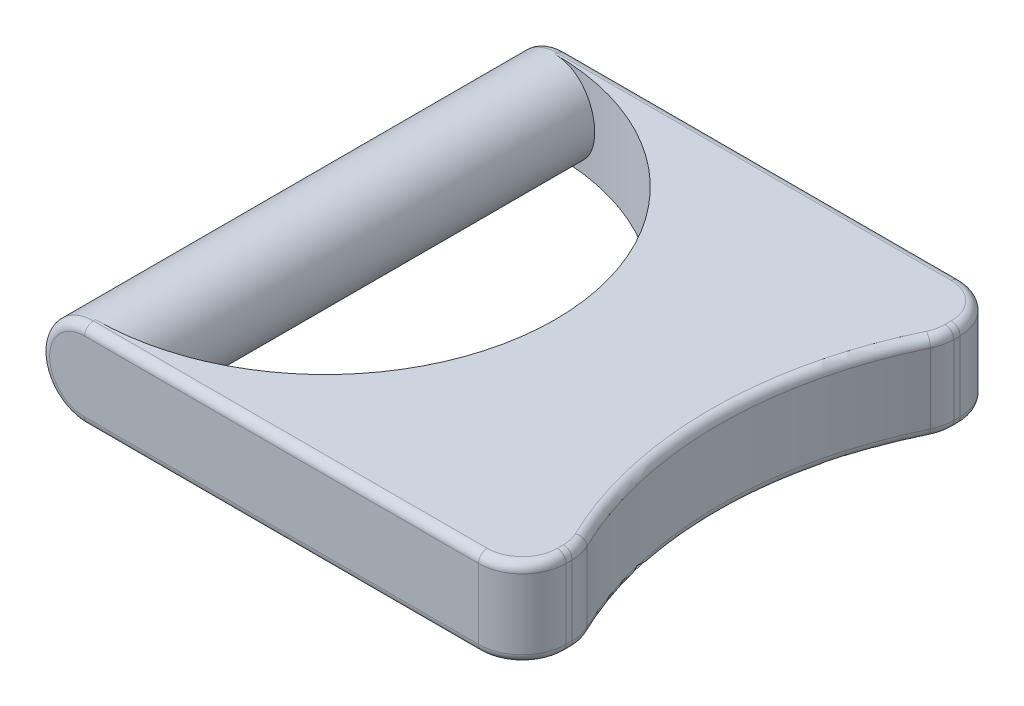
ISO-10303-21;
HEADER;
FILE_DESCRIPTION(('STEP AP214'),'2;1');
FILE_NAME('part.step','',(''),(''),'','','');
FILE_SCHEMA(('AUTOMOTIVE_DESIGN { 1 0 10303 214 1 1 1 1 }'));
ENDSEC;
DATA;
#1=APPLICATION_CONTEXT('core data for automotive mechanical design processes');
#2=APPLICATION_PROTOCOL_DEFINITION('international standard','automotive_design',2000,#1);
#3=PRODUCT_CONTEXT('',#1,'mechanical');
#4=PRODUCT('Part','Part','',(#3));
#5=PRODUCT_RELATED_PRODUCT_CATEGORY('part','',(#4));
#6=PRODUCT_DEFINITION_FORMATION('','',#4);
#7=PRODUCT_DEFINITION_CONTEXT('part definition',#1,'design');
#8=PRODUCT_DEFINITION('design','',#6,#7);
#9=PRODUCT_DEFINITION_SHAPE('','',#8);
#10=(LENGTH_UNIT() NAMED_UNIT(*) SI_UNIT(.MILLI.,.METRE.));
#11=(NAMED_UNIT(*) PLANE_ANGLE_UNIT() SI_UNIT($,.RADIAN.));
#12=(NAMED_UNIT(*) SI_UNIT($,.STERADIAN.) SOLID_ANGLE_UNIT());
#13=UNCERTAINTY_MEASURE_WITH_UNIT(LENGTH_MEASURE(1.E-05),#10,'distance_accuracy_value','');
#14=(GEOMETRIC_REPRESENTATION_CONTEXT(3) GLOBAL_UNCERTAINTY_ASSIGNED_CONTEXT((#13)) GLOBAL_UNIT_ASSIGNED_CONTEXT((#10,
#11,#12)) REPRESENTATION_CONTEXT('',''));
#15=CARTESIAN_POINT('',(0.,0.,0.));
#16=DIRECTION('',(0.,0.,1.));
#17=DIRECTION('',(1.,0.,0.));
#18=AXIS2_PLACEMENT_3D('',#15,#16,#17);
#19=CARTESIAN_POINT('',(9.,1.,-4.35889894354067));
#20=DIRECTION('',(0.,-1.,0.));
#21=DIRECTION('',(0.,0.,-1.));
#22=AXIS2_PLACEMENT_3D('',#19,#20,#21);
#23=CYLINDRICAL_SURFACE('',#22,1.);
#24=DIRECTION('',(0.,1.,0.));
#25=VECTOR('',#24,1.);
#26=CARTESIAN_POINT('',(10.,1.,-4.35889894354067));
#27=LINE('',#26,#25);
#28=CARTESIAN_POINT('',(10.,-0.8,-4.35889894354067));
#29=VERTEX_POINT('',#28);
#30=CARTESIAN_POINT('',(10.,0.8,-4.35889894354067));
#31=VERTEX_POINT('',#30);
#32=EDGE_CURVE('E489',#29,#31,#27,.T.);
#33=ORIENTED_EDGE('',*,*,#32,.T.);
#34=CARTESIAN_POINT('',(9.,0.8,-4.35889894354067));
#35=DIRECTION('',(0.,-1.,0.));
#36=DIRECTION('',(0.,0.,-1.));
#37=AXIS2_PLACEMENT_3D('',#34,#35,#36);
#38=CIRCLE('',#37,1.);
#39=CARTESIAN_POINT('',(9.9,0.8,-3.92300904918661));
#40=VERTEX_POINT('',#39);
#41=EDGE_CURVE('E686',#31,#40,#38,.T.);
#42=ORIENTED_EDGE('',*,*,#41,.T.);
#43=DIRECTION('',(0.,-1.,0.));
#44=VECTOR('',#43,1.);
#45=CARTESIAN_POINT('',(9.9,1.,-3.9230090491866));
#46=LINE('',#45,#44);
#47=CARTESIAN_POINT('',(9.9,-0.8,-3.9230090491866));
#48=VERTEX_POINT('',#47);
#49=EDGE_CURVE('E493',#40,#48,#46,.T.);
#50=ORIENTED_EDGE('',*,*,#49,.T.);
#51=CARTESIAN_POINT('',(9.,-0.8,-4.35889894354067));
#52=DIRECTION('',(0.,-1.,0.));
#53=DIRECTION('',(0.,0.,-1.));
#54=AXIS2_PLACEMENT_3D('',#51,#52,#53);
#55=CIRCLE('',#54,1.);
#56=EDGE_CURVE('E585',#29,#48,#55,.T.);
#57=ORIENTED_EDGE('',*,*,#56,.F.);
#58=EDGE_LOOP('',(#33,#42,#50,#57));
#59=FACE_BOUND('',#58,.T.);
#60=ADVANCED_FACE('F17',(#59),#23,.T.);
#61=CARTESIAN_POINT('',(9.,1.,4.35889894354067));
#62=DIRECTION('',(0.,-1.,0.));
#63=DIRECTION('',(0.,0.,-1.));
#64=AXIS2_PLACEMENT_3D('',#61,#62,#63);
#65=CYLINDRICAL_SURFACE('',#64,1.);
#66=DIRECTION('',(0.,-1.,0.));
#67=VECTOR('',#66,1.);
#68=CARTESIAN_POINT('',(9.90000000000001,1.,3.92300904918661));
#69=LINE('',#68,#67);
#70=CARTESIAN_POINT('',(9.9,-0.8,3.92300904918661));
#71=VERTEX_POINT('',#70);
#72=CARTESIAN_POINT('',(9.9,0.8,3.92300904918661));
#73=VERTEX_POINT('',#72);
#74=EDGE_CURVE('E660',#71,#73,#69,.F.);
#75=ORIENTED_EDGE('',*,*,#74,.T.);
#76=CARTESIAN_POINT('',(9.,0.8,4.35889894354067));
#77=DIRECTION('',(0.,-1.,0.));
#78=DIRECTION('',(0.,0.,-1.));
#79=AXIS2_PLACEMENT_3D('',#76,#77,#78);
#80=CIRCLE('',#79,1.);
#81=CARTESIAN_POINT('',(10.,0.8,4.35889894354067));
#82=VERTEX_POINT('',#81);
#83=EDGE_CURVE('E682',#73,#82,#80,.T.);
#84=ORIENTED_EDGE('',*,*,#83,.T.);
#85=DIRECTION('',(0.,1.,0.));
#86=VECTOR('',#85,1.);
#87=CARTESIAN_POINT('',(10.,1.,4.35889894354067));
#88=LINE('',#87,#86);
#89=CARTESIAN_POINT('',(10.,-0.8,4.35889894354067));
#90=VERTEX_POINT('',#89);
#91=EDGE_CURVE('E676',#82,#90,#88,.F.);
#92=ORIENTED_EDGE('',*,*,#91,.T.);
#93=CARTESIAN_POINT('',(9.,-0.8,4.35889894354067));
#94=DIRECTION('',(0.,-1.,0.));
#95=DIRECTION('',(0.,0.,-1.));
#96=AXIS2_PLACEMENT_3D('',#93,#94,#95);
#97=CIRCLE('',#96,1.);
#98=EDGE_CURVE('E538',#71,#90,#97,.T.);
#99=ORIENTED_EDGE('',*,*,#98,.F.);
#100=EDGE_LOOP('',(#75,#84,#92,#99));
#101=FACE_BOUND('',#100,.T.);
#102=ADVANCED_FACE('F1046',(#101),#65,.T.);
#103=CARTESIAN_POINT('',(10.,1.,4.35889894354067));
#104=DIRECTION('',(-1.,0.,0.));
#105=DIRECTION('',(0.,0.,1.));
#106=AXIS2_PLACEMENT_3D('',#103,#104,#105);
#107=PLANE('',#106);
#108=DIRECTION('',(0.,0.,1.));
#109=VECTOR('',#108,1.);
#110=CARTESIAN_POINT('',(10.,-0.8,4.35889894354067));
#111=LINE('',#110,#109);
#112=CARTESIAN_POINT('',(10.,-0.8,4.49999999999999));
#113=VERTEX_POINT('',#112);
#114=EDGE_CURVE('E537',#90,#113,#111,.T.);
#115=ORIENTED_EDGE('',*,*,#114,.F.);
#116=ORIENTED_EDGE('',*,*,#91,.F.);
#117=DIRECTION('',(0.,0.,1.));
#118=VECTOR('',#117,1.);
#119=CARTESIAN_POINT('',(10.,0.8,4.35889894354067));
#120=LINE('',#119,#118);
#121=CARTESIAN_POINT('',(10.,0.8,4.49999999999999));
#122=VERTEX_POINT('',#121);
#123=EDGE_CURVE('E679',#122,#82,#120,.F.);
#124=ORIENTED_EDGE('',*,*,#123,.F.);
#125=DIRECTION('',(0.,-1.,0.));
#126=VECTOR('',#125,1.);
#127=CARTESIAN_POINT('',(10.,1.,4.49999999999999));
#128=LINE('',#127,#126);
#129=EDGE_CURVE('E659',#113,#122,#128,.F.);
#130=ORIENTED_EDGE('',*,*,#129,.F.);
#131=EDGE_LOOP('',(#115,#116,#124,#130));
#132=FACE_BOUND('',#131,.T.);
#133=ADVANCED_FACE('F1039',(#132),#107,.F.);
#134=CARTESIAN_POINT('',(0.,0.,5.3));
#135=DIRECTION('',(0.,0.,1.));
#136=DIRECTION('',(1.,0.,0.));
#137=AXIS2_PLACEMENT_3D('',#134,#135,#136);
#138=TOROIDAL_SURFACE('',#137,0.8,0.2);
#139=CARTESIAN_POINT('',(0.,-0.8,5.3));
#140=DIRECTION('',(1.,0.,0.));
#141=DIRECTION('',(0.,0.,-1.));
#142=AXIS2_PLACEMENT_3D('',#139,#140,#141);
#143=CIRCLE('',#142,0.2);
#144=CARTESIAN_POINT('',(0.,-0.8,5.5));
#145=VERTEX_POINT('',#144);
#146=CARTESIAN_POINT('',(0.,-1.,5.3));
#147=VERTEX_POINT('',#146);
#148=EDGE_CURVE('E609',#145,#147,#143,.T.);
#149=ORIENTED_EDGE('',*,*,#148,.F.);
#150=CARTESIAN_POINT('',(0.,0.,5.5));
#151=DIRECTION('',(0.,0.,-1.));
#152=DIRECTION('',(0.,-1.,0.));
#153=AXIS2_PLACEMENT_3D('',#150,#151,#152);
#154=CIRCLE('',#153,0.8);
#155=CARTESIAN_POINT('',(0.,0.8,5.5));
#156=VERTEX_POINT('',#155);
#157=EDGE_CURVE('E448',#156,#145,#154,.F.);
#158=ORIENTED_EDGE('',*,*,#157,.F.);
#159=CARTESIAN_POINT('',(0.,0.8,5.3));
#160=DIRECTION('',(-1.,0.,0.));
#161=DIRECTION('',(0.,1.,0.));
#162=AXIS2_PLACEMENT_3D('',#159,#160,#161);
#163=CIRCLE('',#162,0.2);
#164=CARTESIAN_POINT('',(0.,1.,5.3));
#165=VERTEX_POINT('',#164);
#166=EDGE_CURVE('E669',#156,#165,#163,.T.);
#167=ORIENTED_EDGE('',*,*,#166,.T.);
#168=CARTESIAN_POINT('',(0.,0.,5.3));
#169=DIRECTION('',(0.,0.,1.));
#170=DIRECTION('',(1.,0.,0.));
#171=AXIS2_PLACEMENT_3D('',#168,#169,#170);
#172=CIRCLE('',#171,1.);
#173=EDGE_CURVE('E181',#165,#147,#172,.T.);
#174=ORIENTED_EDGE('',*,*,#173,.T.);
#175=EDGE_LOOP('',(#149,#158,#167,#174));
#176=FACE_BOUND('',#175,.T.);
#177=ADVANCED_FACE('F643',(#176),#138,.T.);
#178=CARTESIAN_POINT('',(9.,-0.8,4.5));
#179=DIRECTION('',(0.,-1.,0.));
#180=DIRECTION('',(0.,0.,-1.));
#181=AXIS2_PLACEMENT_3D('',#178,#179,#180);
#182=TOROIDAL_SURFACE('',#181,0.8,0.2);
#183=CARTESIAN_POINT('',(8.99999999999999,-0.8,5.3));
#184=DIRECTION('',(1.,0.,0.));
#185=DIRECTION('',(0.,0.,-1.));
#186=AXIS2_PLACEMENT_3D('',#183,#184,#185);
#187=CIRCLE('',#186,0.2);
#188=CARTESIAN_POINT('',(8.99999999999999,-1.,5.3));
#189=VERTEX_POINT('',#188);
#190=CARTESIAN_POINT('',(8.99999999999999,-0.8,5.5));
#191=VERTEX_POINT('',#190);
#192=EDGE_CURVE('E625',#189,#191,#187,.F.);
#193=ORIENTED_EDGE('',*,*,#192,.F.);
#194=CARTESIAN_POINT('',(9.,-1.,4.5));
#195=DIRECTION('',(0.,1.,0.));
#196=DIRECTION('',(0.,0.,1.));
#197=AXIS2_PLACEMENT_3D('',#194,#195,#196);
#198=CIRCLE('',#197,0.8);
#199=CARTESIAN_POINT('',(9.8,-1.,4.49999999999999));
#200=VERTEX_POINT('',#199);
#201=EDGE_CURVE('E434',#200,#189,#198,.F.);
#202=ORIENTED_EDGE('',*,*,#201,.F.);
#203=CARTESIAN_POINT('',(9.8,-0.8,4.49999999999999));
#204=DIRECTION('',(0.,0.,1.));
#205=DIRECTION('',(1.,0.,0.));
#206=AXIS2_PLACEMENT_3D('',#203,#204,#205);
#207=CIRCLE('',#206,0.200000000000001);
#208=EDGE_CURVE('E531',#113,#200,#207,.F.);
#209=ORIENTED_EDGE('',*,*,#208,.F.);
#210=CARTESIAN_POINT('',(9.,-0.8,4.5));
#211=DIRECTION('',(0.,-1.,0.));
#212=DIRECTION('',(0.,0.,-1.));
#213=AXIS2_PLACEMENT_3D('',#210,#211,#212);
#214=CIRCLE('',#213,1.);
#215=EDGE_CURVE('E651',#191,#113,#214,.F.);
#216=ORIENTED_EDGE('',*,*,#215,.F.);
#217=EDGE_LOOP('',(#193,#202,#209,#216));
#218=FACE_BOUND('',#217,.T.);
#219=ADVANCED_FACE('F638',(#218),#182,.T.);
#220=CARTESIAN_POINT('',(0.,-0.8,5.3));
#221=DIRECTION('',(1.,0.,0.));
#222=DIRECTION('',(0.,0.,-1.));
#223=AXIS2_PLACEMENT_3D('',#220,#221,#222);
#224=CYLINDRICAL_SURFACE('',#223,0.2);
#225=ORIENTED_EDGE('',*,*,#148,.T.);
#226=DIRECTION('',(1.,0.,0.));
#227=VECTOR('',#226,1.);
#228=CARTESIAN_POINT('',(9.,-1.,5.3));
#229=LINE('',#228,#227);
#230=EDGE_CURVE('E429',#189,#147,#229,.F.);
#231=ORIENTED_EDGE('',*,*,#230,.F.);
#232=ORIENTED_EDGE('',*,*,#192,.T.);
#233=DIRECTION('',(1.,0.,0.));
#234=VECTOR('',#233,1.);
#235=CARTESIAN_POINT('',(0.,-0.8,5.5));
#236=LINE('',#235,#234);
#237=EDGE_CURVE('E453',#145,#191,#236,.T.);
#238=ORIENTED_EDGE('',*,*,#237,.F.);
#239=EDGE_LOOP('',(#225,#231,#232,#238));
#240=FACE_BOUND('',#239,.T.);
#241=ADVANCED_FACE('F642',(#240),#224,.T.);
#242=CARTESIAN_POINT('',(9.8,-0.8,-4.49999999999999));
#243=DIRECTION('',(0.,0.,1.));
#244=DIRECTION('',(1.,0.,0.));
#245=AXIS2_PLACEMENT_3D('',#242,#243,#244);
#246=CYLINDRICAL_SURFACE('',#245,0.200000000000001);
#247=CARTESIAN_POINT('',(9.8,-0.8,-4.35889894354067));
#248=DIRECTION('',(0.,0.,1.));
#249=DIRECTION('',(1.,0.,0.));
#250=AXIS2_PLACEMENT_3D('',#247,#248,#249);
#251=CIRCLE('',#250,0.2);
#252=CARTESIAN_POINT('',(9.8,-1.,-4.35889894354067));
#253=VERTEX_POINT('',#252);
#254=EDGE_CURVE('E602',#253,#29,#251,.T.);
#255=ORIENTED_EDGE('',*,*,#254,.F.);
#256=DIRECTION('',(0.,0.,-1.));
#257=VECTOR('',#256,1.);
#258=CARTESIAN_POINT('',(9.8,-1.,-4.5));
#259=LINE('',#258,#257);
#260=CARTESIAN_POINT('',(9.8,-1.,-4.49999999999999));
#261=VERTEX_POINT('',#260);
#262=EDGE_CURVE('E412',#261,#253,#259,.F.);
#263=ORIENTED_EDGE('',*,*,#262,.F.);
#264=CARTESIAN_POINT('',(9.8,-0.8,-4.5));
#265=DIRECTION('',(0.,0.,1.));
#266=DIRECTION('',(1.,0.,0.));
#267=AXIS2_PLACEMENT_3D('',#264,#265,#266);
#268=CIRCLE('',#267,0.2);
#269=CARTESIAN_POINT('',(10.,-0.8,-4.49999999999999));
#270=VERTEX_POINT('',#269);
#271=EDGE_CURVE('E488',#270,#261,#268,.F.);
#272=ORIENTED_EDGE('',*,*,#271,.F.);
#273=DIRECTION('',(0.,0.,1.));
#274=VECTOR('',#273,1.);
#275=CARTESIAN_POINT('',(10.,-0.8,-4.49999999999999));
#276=LINE('',#275,#274);
#277=EDGE_CURVE('E498',#270,#29,#276,.T.);
#278=ORIENTED_EDGE('',*,*,#277,.T.);
#279=EDGE_LOOP('',(#255,#263,#272,#278));
#280=FACE_BOUND('',#279,.T.);
#281=ADVANCED_FACE('F596',(#280),#246,.T.);
#282=CARTESIAN_POINT('',(9.,-0.8,-4.35889894354067));
#283=DIRECTION('',(0.,-1.,0.));
#284=DIRECTION('',(0.,0.,-1.));
#285=AXIS2_PLACEMENT_3D('',#282,#283,#284);
#286=TOROIDAL_SURFACE('',#285,0.8,0.2);
#287=CARTESIAN_POINT('',(9.72,-0.8,-4.01018702805741));
#288=DIRECTION('',(0.435889894354067,0.,-0.9));
#289=DIRECTION('',(-0.9,0.,-0.435889894354067));
#290=AXIS2_PLACEMENT_3D('',#287,#288,#289);
#291=CIRCLE('',#290,0.2);
#292=CARTESIAN_POINT('',(9.72,-1.,-4.01018702805742));
#293=VERTEX_POINT('',#292);
#294=EDGE_CURVE('E566',#293,#48,#291,.F.);
#295=ORIENTED_EDGE('',*,*,#294,.F.);
#296=CARTESIAN_POINT('',(9.,-1.,-4.35889894354067));
#297=DIRECTION('',(0.,1.,0.));
#298=DIRECTION('',(0.899999999999999,0.,0.435889894354069));
#299=AXIS2_PLACEMENT_3D('',#296,#297,#298);
#300=CIRCLE('',#299,0.800000000000001);
#301=EDGE_CURVE('E414',#253,#293,#300,.F.);
#302=ORIENTED_EDGE('',*,*,#301,.F.);
#303=ORIENTED_EDGE('',*,*,#254,.T.);
#304=ORIENTED_EDGE('',*,*,#56,.T.);
#305=EDGE_LOOP('',(#295,#302,#303,#304));
#306=FACE_BOUND('',#305,.T.);
#307=ADVANCED_FACE('F592',(#306),#286,.T.);
#308=CARTESIAN_POINT('',(18.,-0.8,0.));
#309=DIRECTION('',(0.,-1.,0.));
#310=DIRECTION('',(0.,0.,-1.));
#311=AXIS2_PLACEMENT_3D('',#308,#309,#310);
#312=TOROIDAL_SURFACE('',#311,9.2,0.2);
#313=CARTESIAN_POINT('',(9.72,-0.8,4.01018702805742));
#314=DIRECTION('',(0.435889894354067,0.,0.9));
#315=DIRECTION('',(0.9,0.,-0.435889894354067));
#316=AXIS2_PLACEMENT_3D('',#313,#314,#315);
#317=CIRCLE('',#316,0.2);
#318=CARTESIAN_POINT('',(9.72,-1.,4.01018702805742));
#319=VERTEX_POINT('',#318);
#320=EDGE_CURVE('E559',#319,#71,#317,.T.);
#321=ORIENTED_EDGE('',*,*,#320,.F.);
#322=CARTESIAN_POINT('',(18.,-1.,0.));
#323=DIRECTION('',(0.,-1.,0.));
#324=DIRECTION('',(-0.9,0.,0.435889894354068));
#325=AXIS2_PLACEMENT_3D('',#322,#323,#324);
#326=CIRCLE('',#325,9.2);
#327=EDGE_CURVE('E575',#293,#319,#326,.F.);
#328=ORIENTED_EDGE('',*,*,#327,.F.);
#329=ORIENTED_EDGE('',*,*,#294,.T.);
#330=CARTESIAN_POINT('',(18.,-0.8,0.));
#331=DIRECTION('',(0.,-1.,0.));
#332=DIRECTION('',(0.,0.,-1.));
#333=AXIS2_PLACEMENT_3D('',#330,#331,#332);
#334=CIRCLE('',#333,9.);
#335=EDGE_CURVE('E689',#48,#71,#334,.F.);
#336=ORIENTED_EDGE('',*,*,#335,.T.);
#337=EDGE_LOOP('',(#321,#328,#329,#336));
#338=FACE_BOUND('',#337,.T.);
#339=ADVANCED_FACE('F551',(#338),#312,.T.);
#340=CARTESIAN_POINT('',(9.,-0.8,4.35889894354067));
#341=DIRECTION('',(0.,-1.,0.));
#342=DIRECTION('',(0.,0.,-1.));
#343=AXIS2_PLACEMENT_3D('',#340,#341,#342);
#344=TOROIDAL_SURFACE('',#343,0.8,0.2);
#345=CARTESIAN_POINT('',(9.8,-0.8,4.35889894354067));
#346=DIRECTION('',(0.,0.,1.));
#347=DIRECTION('',(1.,0.,0.));
#348=AXIS2_PLACEMENT_3D('',#345,#346,#347);
#349=CIRCLE('',#348,0.200000000000001);
#350=CARTESIAN_POINT('',(9.8,-1.,4.35889894354067));
#351=VERTEX_POINT('',#350);
#352=EDGE_CURVE('E534',#351,#90,#349,.T.);
#353=ORIENTED_EDGE('',*,*,#352,.F.);
#354=CARTESIAN_POINT('',(9.,-1.,4.35889894354067));
#355=DIRECTION('',(0.,1.,0.));
#356=DIRECTION('',(1.,0.,0.));
#357=AXIS2_PLACEMENT_3D('',#354,#355,#356);
#358=CIRCLE('',#357,0.799999999999999);
#359=EDGE_CURVE('E398',#319,#351,#358,.F.);
#360=ORIENTED_EDGE('',*,*,#359,.F.);
#361=ORIENTED_EDGE('',*,*,#320,.T.);
#362=ORIENTED_EDGE('',*,*,#98,.T.);
#363=EDGE_LOOP('',(#353,#360,#361,#362));
#364=FACE_BOUND('',#363,.T.);
#365=ADVANCED_FACE('F547',(#364),#344,.T.);
#366=CARTESIAN_POINT('',(9.8,-0.8,4.35889894354067));
#367=DIRECTION('',(0.,0.,1.));
#368=DIRECTION('',(1.,0.,0.));
#369=AXIS2_PLACEMENT_3D('',#366,#367,#368);
#370=CYLINDRICAL_SURFACE('',#369,0.200000000000001);
#371=ORIENTED_EDGE('',*,*,#208,.T.);
#372=DIRECTION('',(0.,0.,-1.));
#373=VECTOR('',#372,1.);
#374=CARTESIAN_POINT('',(9.8,-1.,-4.5));
#375=LINE('',#374,#373);
#376=EDGE_CURVE('E403',#351,#200,#375,.F.);
#377=ORIENTED_EDGE('',*,*,#376,.F.);
#378=ORIENTED_EDGE('',*,*,#352,.T.);
#379=ORIENTED_EDGE('',*,*,#114,.T.);
#380=EDGE_LOOP('',(#371,#377,#378,#379));
#381=FACE_BOUND('',#380,.T.);
#382=ADVANCED_FACE('F519',(#381),#370,.T.);
#383=CARTESIAN_POINT('',(0.,0.,-5.3));
#384=DIRECTION('',(0.,0.,1.));
#385=DIRECTION('',(1.,0.,0.));
#386=AXIS2_PLACEMENT_3D('',#383,#384,#385);
#387=TOROIDAL_SURFACE('',#386,0.8,0.2);
#388=CARTESIAN_POINT('',(0.,0.8,-5.3));
#389=DIRECTION('',(-1.,0.,0.));
#390=DIRECTION('',(0.,1.,0.));
#391=AXIS2_PLACEMENT_3D('',#388,#389,#390);
#392=CIRCLE('',#391,0.2);
#393=CARTESIAN_POINT('',(0.,1.,-5.3));
#394=VERTEX_POINT('',#393);
#395=CARTESIAN_POINT('',(0.,0.8,-5.5));
#396=VERTEX_POINT('',#395);
#397=EDGE_CURVE('E507',#394,#396,#392,.T.);
#398=ORIENTED_EDGE('',*,*,#397,.T.);
#399=CARTESIAN_POINT('',(0.,0.,-5.5));
#400=DIRECTION('',(0.,0.,1.));
#401=DIRECTION('',(0.,1.,0.));
#402=AXIS2_PLACEMENT_3D('',#399,#400,#401);
#403=CIRCLE('',#402,0.8);
#404=CARTESIAN_POINT('',(0.,-0.8,-5.5));
#405=VERTEX_POINT('',#404);
#406=EDGE_CURVE('E350',#396,#405,#403,.T.);
#407=ORIENTED_EDGE('',*,*,#406,.T.);
#408=CARTESIAN_POINT('',(0.,-0.8,-5.3));
#409=DIRECTION('',(1.,0.,0.));
#410=DIRECTION('',(0.,0.,-1.));
#411=AXIS2_PLACEMENT_3D('',#408,#409,#410);
#412=CIRCLE('',#411,0.2);
#413=CARTESIAN_POINT('',(0.,-1.,-5.3));
#414=VERTEX_POINT('',#413);
#415=EDGE_CURVE('E499',#414,#405,#412,.T.);
#416=ORIENTED_EDGE('',*,*,#415,.F.);
#417=CARTESIAN_POINT('',(0.,0.,-5.3));
#418=DIRECTION('',(0.,0.,-1.));
#419=DIRECTION('',(-1.,0.,0.));
#420=AXIS2_PLACEMENT_3D('',#417,#418,#419);
#421=CIRCLE('',#420,1.);
#422=EDGE_CURVE('E186',#394,#414,#421,.F.);
#423=ORIENTED_EDGE('',*,*,#422,.F.);
#424=EDGE_LOOP('',(#398,#407,#416,#423));
#425=FACE_BOUND('',#424,.T.);
#426=ADVANCED_FACE('F514',(#425),#387,.T.);
#427=CARTESIAN_POINT('',(0.,-0.8,-5.3));
#428=DIRECTION('',(1.,0.,0.));
#429=DIRECTION('',(0.,0.,-1.));
#430=AXIS2_PLACEMENT_3D('',#427,#428,#429);
#431=CYLINDRICAL_SURFACE('',#430,0.2);
#432=CARTESIAN_POINT('',(9.,-0.8,-5.3));
#433=DIRECTION('',(1.,0.,0.));
#434=DIRECTION('',(0.,0.,-1.));
#435=AXIS2_PLACEMENT_3D('',#432,#433,#434);
#436=CIRCLE('',#435,0.2);
#437=CARTESIAN_POINT('',(9.,-1.,-5.3));
#438=VERTEX_POINT('',#437);
#439=CARTESIAN_POINT('',(9.,-0.8,-5.5));
#440=VERTEX_POINT('',#439);
#441=EDGE_CURVE('E486',#438,#440,#436,.T.);
#442=ORIENTED_EDGE('',*,*,#441,.F.);
#443=DIRECTION('',(1.,0.,0.));
#444=VECTOR('',#443,1.);
#445=CARTESIAN_POINT('',(9.,-1.,-5.3));
#446=LINE('',#445,#444);
#447=EDGE_CURVE('E418',#414,#438,#446,.T.);
#448=ORIENTED_EDGE('',*,*,#447,.F.);
#449=ORIENTED_EDGE('',*,*,#415,.T.);
#450=DIRECTION('',(1.,0.,0.));
#451=VECTOR('',#450,1.);
#452=CARTESIAN_POINT('',(0.,-0.8,-5.5));
#453=LINE('',#452,#451);
#454=EDGE_CURVE('E328',#405,#440,#453,.T.);
#455=ORIENTED_EDGE('',*,*,#454,.T.);
#456=EDGE_LOOP('',(#442,#448,#449,#455));
#457=FACE_BOUND('',#456,.T.);
#458=ADVANCED_FACE('F518',(#457),#431,.T.);
#459=CARTESIAN_POINT('',(10.,1.,-4.49999999999999));
#460=DIRECTION('',(-1.,0.,0.));
#461=DIRECTION('',(0.,0.,1.));
#462=AXIS2_PLACEMENT_3D('',#459,#460,#461);
#463=PLANE('',#462);
#464=ORIENTED_EDGE('',*,*,#277,.F.);
#465=DIRECTION('',(0.,-1.,0.));
#466=VECTOR('',#465,1.);
#467=CARTESIAN_POINT('',(10.,1.,-4.49999999999999));
#468=LINE('',#467,#466);
#469=CARTESIAN_POINT('',(10.,0.8,-4.49999999999999));
#470=VERTEX_POINT('',#469);
#471=EDGE_CURVE('E324',#470,#270,#468,.T.);
#472=ORIENTED_EDGE('',*,*,#471,.F.);
#473=DIRECTION('',(0.,0.,1.));
#474=VECTOR('',#473,1.);
#475=CARTESIAN_POINT('',(10.,0.8,-4.49999999999999));
#476=LINE('',#475,#474);
#477=EDGE_CURVE('E496',#31,#470,#476,.F.);
#478=ORIENTED_EDGE('',*,*,#477,.F.);
#479=ORIENTED_EDGE('',*,*,#32,.F.);
#480=EDGE_LOOP('',(#464,#472,#478,#479));
#481=FACE_BOUND('',#480,.T.);
#482=ADVANCED_FACE('F477',(#481),#463,.F.);
#483=CARTESIAN_POINT('',(9.,-0.8,-4.5));
#484=DIRECTION('',(0.,-1.,0.));
#485=DIRECTION('',(0.,0.,-1.));
#486=AXIS2_PLACEMENT_3D('',#483,#484,#485);
#487=TOROIDAL_SURFACE('',#486,0.8,0.2);
#488=ORIENTED_EDGE('',*,*,#271,.T.);
#489=CARTESIAN_POINT('',(9.,-1.,-4.5));
#490=DIRECTION('',(0.,1.,0.));
#491=DIRECTION('',(1.,0.,0.));
#492=AXIS2_PLACEMENT_3D('',#489,#490,#491);
#493=CIRCLE('',#492,0.8);
#494=EDGE_CURVE('E415',#438,#261,#493,.F.);
#495=ORIENTED_EDGE('',*,*,#494,.F.);
#496=ORIENTED_EDGE('',*,*,#441,.T.);
#497=CARTESIAN_POINT('',(9.,-0.8,-4.5));
#498=DIRECTION('',(0.,-1.,0.));
#499=DIRECTION('',(0.,0.,-1.));
#500=AXIS2_PLACEMENT_3D('',#497,#498,#499);
#501=CIRCLE('',#500,1.);
#502=EDGE_CURVE('E327',#270,#440,#501,.F.);
#503=ORIENTED_EDGE('',*,*,#502,.F.);
#504=EDGE_LOOP('',(#488,#495,#496,#503));
#505=FACE_BOUND('',#504,.T.);
#506=ADVANCED_FACE('F471',(#505),#487,.T.);
#507=CARTESIAN_POINT('',(18.,1.,0.));
#508=DIRECTION('',(0.,-1.,0.));
#509=DIRECTION('',(0.,0.,-1.));
#510=AXIS2_PLACEMENT_3D('',#507,#508,#509);
#511=CYLINDRICAL_SURFACE('',#510,9.);
#512=ORIENTED_EDGE('',*,*,#335,.F.);
#513=ORIENTED_EDGE('',*,*,#49,.F.);
#514=CARTESIAN_POINT('',(18.,0.8,0.));
#515=DIRECTION('',(0.,-1.,0.));
#516=DIRECTION('',(0.,0.,-1.));
#517=AXIS2_PLACEMENT_3D('',#514,#515,#516);
#518=CIRCLE('',#517,9.);
#519=EDGE_CURVE('E278',#73,#40,#518,.T.);
#520=ORIENTED_EDGE('',*,*,#519,.F.);
#521=ORIENTED_EDGE('',*,*,#74,.F.);
#522=EDGE_LOOP('',(#512,#513,#520,#521));
#523=FACE_BOUND('',#522,.T.);
#524=ADVANCED_FACE('F467',(#523),#511,.F.);
#525=CARTESIAN_POINT('',(9.,1.,4.5));
#526=DIRECTION('',(0.,-1.,0.));
#527=DIRECTION('',(0.,0.,-1.));
#528=AXIS2_PLACEMENT_3D('',#525,#526,#527);
#529=CYLINDRICAL_SURFACE('',#528,1.);
#530=ORIENTED_EDGE('',*,*,#129,.T.);
#531=CARTESIAN_POINT('',(9.,0.8,4.5));
#532=DIRECTION('',(0.,-1.,0.));
#533=DIRECTION('',(0.,0.,-1.));
#534=AXIS2_PLACEMENT_3D('',#531,#532,#533);
#535=CIRCLE('',#534,1.);
#536=CARTESIAN_POINT('',(8.99999999999999,0.8,5.5));
#537=VERTEX_POINT('',#536);
#538=EDGE_CURVE('E248',#537,#122,#535,.F.);
#539=ORIENTED_EDGE('',*,*,#538,.F.);
#540=DIRECTION('',(0.,1.,0.));
#541=VECTOR('',#540,1.);
#542=CARTESIAN_POINT('',(8.99999999999999,0.,5.5));
#543=LINE('',#542,#541);
#544=EDGE_CURVE('E440',#191,#537,#543,.T.);
#545=ORIENTED_EDGE('',*,*,#544,.F.);
#546=ORIENTED_EDGE('',*,*,#215,.T.);
#547=EDGE_LOOP('',(#530,#539,#545,#546));
#548=FACE_BOUND('',#547,.T.);
#549=ADVANCED_FACE('F464',(#548),#529,.T.);
#550=CARTESIAN_POINT('',(0.,0.,5.5));
#551=DIRECTION('',(0.,0.,1.));
#552=DIRECTION('',(1.,0.,0.));
#553=AXIS2_PLACEMENT_3D('',#550,#551,#552);
#554=PLANE('',#553);
#555=ORIENTED_EDGE('',*,*,#544,.T.);
#556=DIRECTION('',(-1.,0.,0.));
#557=VECTOR('',#556,1.);
#558=CARTESIAN_POINT('',(9.,0.8,5.5));
#559=LINE('',#558,#557);
#560=EDGE_CURVE('E772',#156,#537,#559,.F.);
#561=ORIENTED_EDGE('',*,*,#560,.F.);
#562=ORIENTED_EDGE('',*,*,#157,.T.);
#563=ORIENTED_EDGE('',*,*,#237,.T.);
#564=EDGE_LOOP('',(#555,#561,#562,#563));
#565=FACE_BOUND('',#564,.T.);
#566=ADVANCED_FACE('F455',(#565),#554,.T.);
#567=CARTESIAN_POINT('',(0.,0.,5.5));
#568=DIRECTION('',(0.,0.,-1.));
#569=DIRECTION('',(-1.,0.,0.));
#570=AXIS2_PLACEMENT_3D('',#567,#568,#569);
#571=CYLINDRICAL_SURFACE('',#570,1.);
#572=DIRECTION('',(0.,0.,-1.));
#573=VECTOR('',#572,1.);
#574=CARTESIAN_POINT('',(0.,1.,5.5));
#575=LINE('',#574,#573);
#576=CARTESIAN_POINT('',(0.,1.,5.25));
#577=VERTEX_POINT('',#576);
#578=EDGE_CURVE('E178',#165,#577,#575,.T.);
#579=ORIENTED_EDGE('',*,*,#578,.T.);
#580=CARTESIAN_POINT('',(0.,1.,5.25));
#581=CARTESIAN_POINT('',(0.0278662519595787,1.00000010409348,5.25000122886892));
#582=CARTESIAN_POINT('',(0.0557189152045278,0.998834469092113,5.24977785869847));
#583=CARTESIAN_POINT('',(0.111220137908951,0.994186191212378,5.24889497899721));
#584=CARTESIAN_POINT('',(0.13886871991216,0.9907038082458,5.24823551839065));
#585=CARTESIAN_POINT('',(0.221125882949768,0.976824193721324,5.24562652054502));
#586=CARTESIAN_POINT('',(0.275175861957072,0.962994340469435,5.24304624837473));
#587=CARTESIAN_POINT('',(0.380134963801984,0.92660025189307,5.23648464402961));
#588=CARTESIAN_POINT('',(0.431043517745252,0.90403443988637,5.23250305895499));
#589=CARTESIAN_POINT('',(0.528361467966492,0.850827968804526,5.22357374305839));
#590=CARTESIAN_POINT('',(0.574770751322416,0.820187107134674,5.21862598799701));
#591=CARTESIAN_POINT('',(0.662323814246634,0.751308172441524,5.20824302166558));
#592=CARTESIAN_POINT('',(0.7034049972274,0.71299127408116,5.20280310380903));
#593=CARTESIAN_POINT('',(0.77861027149677,0.630001928915434,5.19208173187501));
#594=CARTESIAN_POINT('',(0.812731748389963,0.585327104431204,5.18680033797968));
#595=CARTESIAN_POINT('',(0.873310452922385,0.490433994523111,5.1769471414069));
#596=CARTESIAN_POINT('',(0.899699307920095,0.440171376252712,5.17238182566331));
#597=CARTESIAN_POINT('',(0.943605694926473,0.335861277739533,5.16455324658576));
#598=CARTESIAN_POINT('',(0.961133774071194,0.281818384907774,5.16128843622412));
#599=CARTESIAN_POINT('',(0.98260675260274,0.189575473724406,5.15723349418876));
#600=CARTESIAN_POINT('',(0.989119053688043,0.151973237406372,5.15598325159438));
#601=CARTESIAN_POINT('',(0.997816510241658,0.0762526699560065,5.15430709685811));
#602=CARTESIAN_POINT('',(1.00000166027621,0.0381343381756564,5.15388118575136));
#603=CARTESIAN_POINT('',(0.999997578780897,-0.0556121850763087,5.15388326615818));
#604=CARTESIAN_POINT('',(0.995344454574492,-0.111258411052324,5.15479208784336));
#605=CARTESIAN_POINT('',(0.976865721192977,-0.220987029078527,5.15832514463965));
#606=CARTESIAN_POINT('',(0.963030817984844,-0.27506777856693,5.1609511178561));
#607=CARTESIAN_POINT('',(0.926630107455632,-0.380051746230091,5.1676103304548));
#608=CARTESIAN_POINT('',(0.904073246277761,-0.430958158404688,5.17164212746371));
#609=CARTESIAN_POINT('',(0.850891239604926,-0.528260092645953,5.18065711737193));
#610=CARTESIAN_POINT('',(0.820266838711723,-0.574656030470676,5.1856402224576));
#611=CARTESIAN_POINT('',(0.751400572019868,-0.662219853756542,5.19606780825002));
#612=CARTESIAN_POINT('',(0.71307517082432,-0.703321494750749,5.20151693498964));
#613=CARTESIAN_POINT('',(0.630071900726923,-0.778554324663137,5.21222187215429));
#614=CARTESIAN_POINT('',(0.585393352830044,-0.812684767580648,5.21747766184067));
#615=CARTESIAN_POINT('',(0.490511216224404,-0.873265877240596,5.22725447781173));
#616=CARTESIAN_POINT('',(0.440265674308183,-0.899651872526125,5.23176918517423));
#617=CARTESIAN_POINT('',(0.335962774964295,-0.943570685960797,5.23949957335586));
#618=CARTESIAN_POINT('',(0.28190783666713,-0.96110906600477,5.24271607001696));
#619=CARTESIAN_POINT('',(0.189619169440596,-0.982599197677946,5.24670646335199));
#620=CARTESIAN_POINT('',(0.151982678586761,-0.989117405825371,5.24793499165801));
#621=CARTESIAN_POINT('',(0.0762367543709793,-0.997818900601878,5.24958451809861));
#622=CARTESIAN_POINT('',(0.0381278854992261,-1.00000693775249,5.25000640116613));
#623=CARTESIAN_POINT('',(0.,-1.,5.25));
#624=B_SPLINE_CURVE_WITH_KNOTS('',3,(#580,#581,#582,#583,#584,#585,#586,#587,#588,#589,#590,
#591,#592,#593,#594,#595,#596,#597,#598,#599,#600,#601,#602,#603,#604,#605,#606,#607,#608,#609,
#610,#611,#612,#613,#614,#615,#616,#617,#618,#619,#620,#621,#622,#623),.UNSPECIFIED.,.F.,.F.,(4,
2,2,2,2,2,2,2,2,2,2,2,2,2,2,2,2,2,2,2,2,4),(0.,0.0835466383524701,0.167083905338021,
0.333773528231167,0.500493249616149,0.6672171542261,0.835750078442883,1.0043461954876,
1.17439094105603,1.34423279996821,1.45853942377388,1.57284619111835,1.73954238686072,
1.90640757466192,2.07310206033479,2.23978116615806,2.40837671106174,2.57699028824183,
2.7469742629898,2.91685124678277,3.03125916642855,3.14554150229467),.UNSPECIFIED.);
#625=CARTESIAN_POINT('',(0.,-1.,5.25));
#626=VERTEX_POINT('',#625);
#627=EDGE_CURVE('E167',#577,#626,#624,.T.);
#628=ORIENTED_EDGE('',*,*,#627,.T.);
#629=DIRECTION('',(0.,0.,-1.));
#630=VECTOR('',#629,1.);
#631=CARTESIAN_POINT('',(0.,-1.,-4.5));
#632=LINE('',#631,#630);
#633=EDGE_CURVE('E425',#147,#626,#632,.T.);
#634=ORIENTED_EDGE('',*,*,#633,.F.);
#635=ORIENTED_EDGE('',*,*,#173,.F.);
#636=EDGE_LOOP('',(#579,#628,#634,#635));
#637=FACE_BOUND('',#636,.T.);
#638=DIRECTION('',(0.,0.,-1.));
#639=VECTOR('',#638,1.);
#640=CARTESIAN_POINT('',(0.,-1.,-4.5));
#641=LINE('',#640,#639);
#642=CARTESIAN_POINT('',(0.,-1.,-5.25));
#643=VERTEX_POINT('',#642);
#644=EDGE_CURVE('E420',#643,#414,#641,.T.);
#645=ORIENTED_EDGE('',*,*,#644,.F.);
#646=CARTESIAN_POINT('',(0.,-1.,-5.25));
#647=CARTESIAN_POINT('',(0.0278662519595783,-1.00000010409348,-5.25000122886892));
#648=CARTESIAN_POINT('',(0.0557189152045276,-0.998834469092113,-5.24977785869847));
#649=CARTESIAN_POINT('',(0.11122013790895,-0.994186191212378,-5.24889497899721));
#650=CARTESIAN_POINT('',(0.13886871991216,-0.9907038082458,-5.24823551839065));
#651=CARTESIAN_POINT('',(0.221125882949768,-0.976824193721324,-5.24562652054502));
#652=CARTESIAN_POINT('',(0.275175861957072,-0.962994340469435,-5.24304624837473));
#653=CARTESIAN_POINT('',(0.380134963801984,-0.92660025189307,-5.23648464402961));
#654=CARTESIAN_POINT('',(0.431043517745253,-0.90403443988637,-5.23250305895499));
#655=CARTESIAN_POINT('',(0.528361467966492,-0.850827968804526,-5.22357374305839));
#656=CARTESIAN_POINT('',(0.574770751322416,-0.820187107134674,-5.21862598799701));
#657=CARTESIAN_POINT('',(0.662323814246635,-0.751308172441524,-5.20824302166558));
#658=CARTESIAN_POINT('',(0.703404997227401,-0.712991274081159,-5.20280310380903));
#659=CARTESIAN_POINT('',(0.77861027149677,-0.630001928915434,-5.19208173187501));
#660=CARTESIAN_POINT('',(0.812731748389963,-0.585327104431204,-5.18680033797968));
#661=CARTESIAN_POINT('',(0.873310452922385,-0.49043399452311,-5.1769471414069));
#662=CARTESIAN_POINT('',(0.899699307920095,-0.440171376252712,-5.17238182566331));
#663=CARTESIAN_POINT('',(0.943605694926473,-0.335861277739533,-5.16455324658576));
#664=CARTESIAN_POINT('',(0.961133774071194,-0.281818384907773,-5.16128843622413));
#665=CARTESIAN_POINT('',(0.98260675260274,-0.189575473724405,-5.15723349418876));
#666=CARTESIAN_POINT('',(0.989119053688043,-0.151973237406371,-5.15598325159438));
#667=CARTESIAN_POINT('',(0.997816510241659,-0.076252669956006,-5.15430709685811));
#668=CARTESIAN_POINT('',(1.00000166027621,-0.038134338175656,-5.15388118575136));
#669=CARTESIAN_POINT('',(0.999997578780897,0.055612185076309,-5.15388326615818));
#670=CARTESIAN_POINT('',(0.995344454574492,0.111258411052324,-5.15479208784336));
#671=CARTESIAN_POINT('',(0.976865721192977,0.220987029078527,-5.15832514463965));
#672=CARTESIAN_POINT('',(0.963030817984843,0.27506777856693,-5.1609511178561));
#673=CARTESIAN_POINT('',(0.926630107455632,0.380051746230092,-5.1676103304548));
#674=CARTESIAN_POINT('',(0.904073246277761,0.430958158404689,-5.17164212746371));
#675=CARTESIAN_POINT('',(0.850891239604926,0.528260092645954,-5.18065711737193));
#676=CARTESIAN_POINT('',(0.820266838711723,0.574656030470676,-5.1856402224576));
#677=CARTESIAN_POINT('',(0.751400572019868,0.662219853756542,-5.19606780825002));
#678=CARTESIAN_POINT('',(0.713075170824319,0.70332149475075,-5.20151693498964));
#679=CARTESIAN_POINT('',(0.630071900726922,0.778554324663138,-5.21222187215429));
#680=CARTESIAN_POINT('',(0.585393352830043,0.812684767580648,-5.21747766184067));
#681=CARTESIAN_POINT('',(0.490511216224403,0.873265877240596,-5.22725447781173));
#682=CARTESIAN_POINT('',(0.440265674308182,0.899651872526125,-5.23176918517423));
#683=CARTESIAN_POINT('',(0.335962774964294,0.943570685960797,-5.23949957335586));
#684=CARTESIAN_POINT('',(0.28190783666713,0.96110906600477,-5.24271607001696));
#685=CARTESIAN_POINT('',(0.189619169440595,0.982599197677946,-5.24670646335199));
#686=CARTESIAN_POINT('',(0.15198267858676,0.989117405825371,-5.24793499165801));
#687=CARTESIAN_POINT('',(0.076236754370979,0.997818900601878,-5.24958451809861));
#688=CARTESIAN_POINT('',(0.038127885499226,1.00000693775248,-5.25000640116613));
#689=CARTESIAN_POINT('',(0.,1.,-5.25));
#690=B_SPLINE_CURVE_WITH_KNOTS('',3,(#646,#647,#648,#649,#650,#651,#652,#653,#654,#655,#656,
#657,#658,#659,#660,#661,#662,#663,#664,#665,#666,#667,#668,#669,#670,#671,#672,#673,#674,#675,
#676,#677,#678,#679,#680,#681,#682,#683,#684,#685,#686,#687,#688,#689),.UNSPECIFIED.,.F.,.F.,(4,
2,2,2,2,2,2,2,2,2,2,2,2,2,2,2,2,2,2,2,2,4),(0.,0.0835466383524701,0.167083905338021,
0.333773528231167,0.500493249616149,0.667217154226101,0.835750078442884,1.0043461954876,
1.17439094105603,1.34423279996821,1.45853942377389,1.57284619111835,1.73954238686072,
1.90640757466192,2.07310206033479,2.23978116615806,2.40837671106175,2.57699028824183,
2.7469742629898,2.91685124678277,3.03125916642855,3.14554150229467),.UNSPECIFIED.);
#691=CARTESIAN_POINT('',(0.,1.,-5.25));
#692=VERTEX_POINT('',#691);
#693=EDGE_CURVE('E20',#643,#692,#690,.T.);
#694=ORIENTED_EDGE('',*,*,#693,.T.);
#695=DIRECTION('',(0.,0.,-1.));
#696=VECTOR('',#695,1.);
#697=CARTESIAN_POINT('',(0.,1.,5.5));
#698=LINE('',#697,#696);
#699=EDGE_CURVE('E187',#692,#394,#698,.T.);
#700=ORIENTED_EDGE('',*,*,#699,.T.);
#701=ORIENTED_EDGE('',*,*,#422,.T.);
#702=EDGE_LOOP('',(#645,#694,#700,#701));
#703=FACE_BOUND('',#702,.T.);
#704=ADVANCED_FACE('F179',(#637,#703),#571,.T.);
#705=CARTESIAN_POINT('',(9.,-1.,-4.5));
#706=DIRECTION('',(0.,-1.,0.));
#707=DIRECTION('',(0.,0.,-1.));
#708=AXIS2_PLACEMENT_3D('',#705,#706,#707);
#709=PLANE('',#708);
#710=ORIENTED_EDGE('',*,*,#359,.T.);
#711=ORIENTED_EDGE('',*,*,#376,.T.);
#712=ORIENTED_EDGE('',*,*,#201,.T.);
#713=ORIENTED_EDGE('',*,*,#230,.T.);
#714=ORIENTED_EDGE('',*,*,#633,.T.);
#715=CARTESIAN_POINT('',(0.,-1.,0.));
#716=DIRECTION('',(0.,-1.,0.));
#717=DIRECTION('',(0.,0.,-1.));
#718=AXIS2_PLACEMENT_3D('',#715,#716,#717);
#719=CIRCLE('',#718,5.25);
#720=EDGE_CURVE('E174',#626,#643,#719,.F.);
#721=ORIENTED_EDGE('',*,*,#720,.T.);
#722=ORIENTED_EDGE('',*,*,#644,.T.);
#723=ORIENTED_EDGE('',*,*,#447,.T.);
#724=ORIENTED_EDGE('',*,*,#494,.T.);
#725=ORIENTED_EDGE('',*,*,#262,.T.);
#726=ORIENTED_EDGE('',*,*,#301,.T.);
#727=ORIENTED_EDGE('',*,*,#327,.T.);
#728=EDGE_LOOP('',(#710,#711,#712,#713,#714,#721,#722,#723,#724,#725,#726,#727));
#729=FACE_BOUND('',#728,.T.);
#730=ADVANCED_FACE('F365',(#729),#709,.T.);
#731=CARTESIAN_POINT('',(0.,0.,-5.5));
#732=DIRECTION('',(0.,0.,1.));
#733=DIRECTION('',(1.,0.,0.));
#734=AXIS2_PLACEMENT_3D('',#731,#732,#733);
#735=PLANE('',#734);
#736=ORIENTED_EDGE('',*,*,#454,.F.);
#737=ORIENTED_EDGE('',*,*,#406,.F.);
#738=DIRECTION('',(-1.,0.,0.));
#739=VECTOR('',#738,1.);
#740=CARTESIAN_POINT('',(9.,0.8,-5.5));
#741=LINE('',#740,#739);
#742=CARTESIAN_POINT('',(9.,0.8,-5.5));
#743=VERTEX_POINT('',#742);
#744=EDGE_CURVE('E203',#743,#396,#741,.T.);
#745=ORIENTED_EDGE('',*,*,#744,.F.);
#746=DIRECTION('',(0.,-1.,0.));
#747=VECTOR('',#746,1.);
#748=CARTESIAN_POINT('',(9.,1.,-5.5));
#749=LINE('',#748,#747);
#750=EDGE_CURVE('E321',#440,#743,#749,.F.);
#751=ORIENTED_EDGE('',*,*,#750,.F.);
#752=EDGE_LOOP('',(#736,#737,#745,#751));
#753=FACE_BOUND('',#752,.T.);
#754=ADVANCED_FACE('F356',(#753),#735,.F.);
#755=CARTESIAN_POINT('',(9.,1.,-4.5));
#756=DIRECTION('',(0.,-1.,0.));
#757=DIRECTION('',(0.,0.,-1.));
#758=AXIS2_PLACEMENT_3D('',#755,#756,#757);
#759=CYLINDRICAL_SURFACE('',#758,1.);
#760=ORIENTED_EDGE('',*,*,#750,.T.);
#761=CARTESIAN_POINT('',(9.,0.8,-4.5));
#762=DIRECTION('',(0.,-1.,0.));
#763=DIRECTION('',(0.,0.,-1.));
#764=AXIS2_PLACEMENT_3D('',#761,#762,#763);
#765=CIRCLE('',#764,1.);
#766=EDGE_CURVE('E331',#470,#743,#765,.F.);
#767=ORIENTED_EDGE('',*,*,#766,.F.);
#768=ORIENTED_EDGE('',*,*,#471,.T.);
#769=ORIENTED_EDGE('',*,*,#502,.T.);
#770=EDGE_LOOP('',(#760,#767,#768,#769));
#771=FACE_BOUND('',#770,.T.);
#772=ADVANCED_FACE('F364',(#771),#759,.T.);
#773=CARTESIAN_POINT('',(9.8,0.8,-4.5));
#774=DIRECTION('',(0.,0.,-1.));
#775=DIRECTION('',(-1.,0.,0.));
#776=AXIS2_PLACEMENT_3D('',#773,#774,#775);
#777=CYLINDRICAL_SURFACE('',#776,0.200000000000001);
#778=CARTESIAN_POINT('',(9.8,0.8,-4.35889894354067));
#779=DIRECTION('',(0.,0.,1.));
#780=DIRECTION('',(1.,0.,0.));
#781=AXIS2_PLACEMENT_3D('',#778,#779,#780);
#782=CIRCLE('',#781,0.2);
#783=CARTESIAN_POINT('',(9.8,1.,-4.35889894354067));
#784=VERTEX_POINT('',#783);
#785=EDGE_CURVE('E298',#31,#784,#782,.T.);
#786=ORIENTED_EDGE('',*,*,#785,.F.);
#787=ORIENTED_EDGE('',*,*,#477,.T.);
#788=CARTESIAN_POINT('',(9.8,0.8,-4.49999999999999));
#789=DIRECTION('',(0.,0.,1.));
#790=DIRECTION('',(1.,0.,0.));
#791=AXIS2_PLACEMENT_3D('',#788,#789,#790);
#792=CIRCLE('',#791,0.2);
#793=CARTESIAN_POINT('',(9.8,1.,-4.49999999999999));
#794=VERTEX_POINT('',#793);
#795=EDGE_CURVE('E334',#794,#470,#792,.F.);
#796=ORIENTED_EDGE('',*,*,#795,.F.);
#797=DIRECTION('',(0.,0.,-1.));
#798=VECTOR('',#797,1.);
#799=CARTESIAN_POINT('',(9.8,1.,-4.5));
#800=LINE('',#799,#798);
#801=EDGE_CURVE('E333',#794,#784,#800,.F.);
#802=ORIENTED_EDGE('',*,*,#801,.T.);
#803=EDGE_LOOP('',(#786,#787,#796,#802));
#804=FACE_BOUND('',#803,.T.);
#805=ADVANCED_FACE('F309',(#804),#777,.T.);
#806=CARTESIAN_POINT('',(9.,0.8,-4.35889894354067));
#807=DIRECTION('',(0.,-1.,0.));
#808=DIRECTION('',(0.,0.,-1.));
#809=AXIS2_PLACEMENT_3D('',#806,#807,#808);
#810=TOROIDAL_SURFACE('',#809,0.8,0.2);
#811=CARTESIAN_POINT('',(9.72,0.8,-4.01018702805742));
#812=DIRECTION('',(0.435889894354068,0.,-0.9));
#813=DIRECTION('',(-0.9,0.,-0.435889894354068));
#814=AXIS2_PLACEMENT_3D('',#811,#812,#813);
#815=CIRCLE('',#814,0.2);
#816=CARTESIAN_POINT('',(9.72,1.,-4.01018702805742));
#817=VERTEX_POINT('',#816);
#818=EDGE_CURVE('E291',#40,#817,#815,.F.);
#819=ORIENTED_EDGE('',*,*,#818,.F.);
#820=ORIENTED_EDGE('',*,*,#41,.F.);
#821=ORIENTED_EDGE('',*,*,#785,.T.);
#822=CARTESIAN_POINT('',(9.,1.,-4.35889894354067));
#823=DIRECTION('',(0.,-1.,0.));
#824=DIRECTION('',(1.,0.,0.));
#825=AXIS2_PLACEMENT_3D('',#822,#823,#824);
#826=CIRCLE('',#825,0.8);
#827=EDGE_CURVE('E796',#784,#817,#826,.T.);
#828=ORIENTED_EDGE('',*,*,#827,.T.);
#829=EDGE_LOOP('',(#819,#820,#821,#828));
#830=FACE_BOUND('',#829,.T.);
#831=ADVANCED_FACE('F305',(#830),#810,.T.);
#832=CARTESIAN_POINT('',(18.,0.8,0.));
#833=DIRECTION('',(0.,-1.,0.));
#834=DIRECTION('',(0.,0.,-1.));
#835=AXIS2_PLACEMENT_3D('',#832,#833,#834);
#836=TOROIDAL_SURFACE('',#835,9.2,0.2);
#837=CARTESIAN_POINT('',(9.72,0.8,4.01018702805742));
#838=DIRECTION('',(0.435889894354068,0.,0.9));
#839=DIRECTION('',(0.9,0.,-0.435889894354068));
#840=AXIS2_PLACEMENT_3D('',#837,#838,#839);
#841=CIRCLE('',#840,0.2);
#842=CARTESIAN_POINT('',(9.72,1.,4.01018702805742));
#843=VERTEX_POINT('',#842);
#844=EDGE_CURVE('E253',#73,#843,#841,.T.);
#845=ORIENTED_EDGE('',*,*,#844,.F.);
#846=ORIENTED_EDGE('',*,*,#519,.T.);
#847=ORIENTED_EDGE('',*,*,#818,.T.);
#848=CARTESIAN_POINT('',(18.,1.,0.));
#849=DIRECTION('',(0.,1.,0.));
#850=DIRECTION('',(-0.9,0.,-0.435889894354067));
#851=AXIS2_PLACEMENT_3D('',#848,#849,#850);
#852=CIRCLE('',#851,9.2);
#853=EDGE_CURVE('E287',#817,#843,#852,.T.);
#854=ORIENTED_EDGE('',*,*,#853,.T.);
#855=EDGE_LOOP('',(#845,#846,#847,#854));
#856=FACE_BOUND('',#855,.T.);
#857=ADVANCED_FACE('F264',(#856),#836,.T.);
#858=CARTESIAN_POINT('',(9.,0.8,4.35889894354067));
#859=DIRECTION('',(0.,-1.,0.));
#860=DIRECTION('',(0.,0.,-1.));
#861=AXIS2_PLACEMENT_3D('',#858,#859,#860);
#862=TOROIDAL_SURFACE('',#861,0.8,0.2);
#863=CARTESIAN_POINT('',(9.8,0.8,4.35889894354067));
#864=DIRECTION('',(0.,0.,-1.));
#865=DIRECTION('',(-1.,0.,0.));
#866=AXIS2_PLACEMENT_3D('',#863,#864,#865);
#867=CIRCLE('',#866,0.200000000000001);
#868=CARTESIAN_POINT('',(9.8,1.,4.35889894354067));
#869=VERTEX_POINT('',#868);
#870=EDGE_CURVE('E249',#82,#869,#867,.F.);
#871=ORIENTED_EDGE('',*,*,#870,.F.);
#872=ORIENTED_EDGE('',*,*,#83,.F.);
#873=ORIENTED_EDGE('',*,*,#844,.T.);
#874=CARTESIAN_POINT('',(9.,1.,4.35889894354067));
#875=DIRECTION('',(0.,-1.,0.));
#876=DIRECTION('',(0.9,0.,-0.435889894354067));
#877=AXIS2_PLACEMENT_3D('',#874,#875,#876);
#878=CIRCLE('',#877,0.8);
#879=EDGE_CURVE('E787',#843,#869,#878,.T.);
#880=ORIENTED_EDGE('',*,*,#879,.T.);
#881=EDGE_LOOP('',(#871,#872,#873,#880));
#882=FACE_BOUND('',#881,.T.);
#883=ADVANCED_FACE('F260',(#882),#862,.T.);
#884=CARTESIAN_POINT('',(9.8,0.8,-4.5));
#885=DIRECTION('',(0.,0.,-1.));
#886=DIRECTION('',(-1.,0.,0.));
#887=AXIS2_PLACEMENT_3D('',#884,#885,#886);
#888=CYLINDRICAL_SURFACE('',#887,0.200000000000001);
#889=CARTESIAN_POINT('',(9.8,0.8,4.49999999999999));
#890=DIRECTION('',(0.,0.,1.));
#891=DIRECTION('',(1.,0.,0.));
#892=AXIS2_PLACEMENT_3D('',#889,#890,#891);
#893=CIRCLE('',#892,0.2);
#894=CARTESIAN_POINT('',(9.8,1.,4.49999999999999));
#895=VERTEX_POINT('',#894);
#896=EDGE_CURVE('E241',#122,#895,#893,.T.);
#897=ORIENTED_EDGE('',*,*,#896,.F.);
#898=ORIENTED_EDGE('',*,*,#123,.T.);
#899=ORIENTED_EDGE('',*,*,#870,.T.);
#900=DIRECTION('',(0.,0.,-1.));
#901=VECTOR('',#900,1.);
#902=CARTESIAN_POINT('',(9.8,1.,-4.5));
#903=LINE('',#902,#901);
#904=EDGE_CURVE('E784',#869,#895,#903,.F.);
#905=ORIENTED_EDGE('',*,*,#904,.T.);
#906=EDGE_LOOP('',(#897,#898,#899,#905));
#907=FACE_BOUND('',#906,.T.);
#908=ADVANCED_FACE('F226',(#907),#888,.T.);
#909=CARTESIAN_POINT('',(9.,0.8,4.5));
#910=DIRECTION('',(0.,-1.,0.));
#911=DIRECTION('',(0.,0.,-1.));
#912=AXIS2_PLACEMENT_3D('',#909,#910,#911);
#913=TOROIDAL_SURFACE('',#912,0.8,0.2);
#914=CARTESIAN_POINT('',(8.99999999999999,0.8,5.3));
#915=DIRECTION('',(-1.,0.,0.));
#916=DIRECTION('',(0.,0.,1.));
#917=AXIS2_PLACEMENT_3D('',#914,#915,#916);
#918=CIRCLE('',#917,0.2);
#919=CARTESIAN_POINT('',(8.99999999999999,1.,5.3));
#920=VERTEX_POINT('',#919);
#921=EDGE_CURVE('E771',#537,#920,#918,.T.);
#922=ORIENTED_EDGE('',*,*,#921,.F.);
#923=ORIENTED_EDGE('',*,*,#538,.T.);
#924=ORIENTED_EDGE('',*,*,#896,.T.);
#925=CARTESIAN_POINT('',(9.,1.,4.5));
#926=DIRECTION('',(0.,-1.,0.));
#927=DIRECTION('',(1.,0.,0.));
#928=AXIS2_PLACEMENT_3D('',#925,#926,#927);
#929=CIRCLE('',#928,0.8);
#930=EDGE_CURVE('E197',#895,#920,#929,.T.);
#931=ORIENTED_EDGE('',*,*,#930,.T.);
#932=EDGE_LOOP('',(#922,#923,#924,#931));
#933=FACE_BOUND('',#932,.T.);
#934=ADVANCED_FACE('F220',(#933),#913,.T.);
#935=CARTESIAN_POINT('',(9.,0.8,5.3));
#936=DIRECTION('',(-1.,0.,0.));
#937=DIRECTION('',(0.,0.,1.));
#938=AXIS2_PLACEMENT_3D('',#935,#936,#937);
#939=CYLINDRICAL_SURFACE('',#938,0.2);
#940=ORIENTED_EDGE('',*,*,#166,.F.);
#941=ORIENTED_EDGE('',*,*,#560,.T.);
#942=ORIENTED_EDGE('',*,*,#921,.T.);
#943=DIRECTION('',(1.,0.,0.));
#944=VECTOR('',#943,1.);
#945=CARTESIAN_POINT('',(9.,1.,5.3));
#946=LINE('',#945,#944);
#947=EDGE_CURVE('E193',#920,#165,#946,.F.);
#948=ORIENTED_EDGE('',*,*,#947,.T.);
#949=EDGE_LOOP('',(#940,#941,#942,#948));
#950=FACE_BOUND('',#949,.T.);
#951=ADVANCED_FACE('F215',(#950),#939,.T.);
#952=CARTESIAN_POINT('',(0.,1.,0.));
#953=DIRECTION('',(0.,-1.,0.));
#954=DIRECTION('',(0.,0.,-1.));
#955=AXIS2_PLACEMENT_3D('',#952,#953,#954);
#956=CYLINDRICAL_SURFACE('',#955,5.25);
#957=ORIENTED_EDGE('',*,*,#627,.F.);
#958=CARTESIAN_POINT('',(0.,1.,0.));
#959=DIRECTION('',(0.,-1.,0.));
#960=DIRECTION('',(0.,0.,-1.));
#961=AXIS2_PLACEMENT_3D('',#958,#959,#960);
#962=CIRCLE('',#961,5.25);
#963=EDGE_CURVE('E172',#577,#692,#962,.F.);
#964=ORIENTED_EDGE('',*,*,#963,.T.);
#965=ORIENTED_EDGE('',*,*,#693,.F.);
#966=ORIENTED_EDGE('',*,*,#720,.F.);
#967=EDGE_LOOP('',(#957,#964,#965,#966));
#968=FACE_BOUND('',#967,.T.);
#969=ADVANCED_FACE('F169',(#968),#956,.F.);
#970=CARTESIAN_POINT('',(9.,0.8,-5.3));
#971=DIRECTION('',(-1.,0.,0.));
#972=DIRECTION('',(0.,0.,1.));
#973=AXIS2_PLACEMENT_3D('',#970,#971,#972);
#974=CYLINDRICAL_SURFACE('',#973,0.2);
#975=CARTESIAN_POINT('',(9.,0.8,-5.3));
#976=DIRECTION('',(1.,0.,0.));
#977=DIRECTION('',(0.,0.,-1.));
#978=AXIS2_PLACEMENT_3D('',#975,#976,#977);
#979=CIRCLE('',#978,0.2);
#980=CARTESIAN_POINT('',(9.,1.,-5.3));
#981=VERTEX_POINT('',#980);
#982=EDGE_CURVE('E38',#743,#981,#979,.T.);
#983=ORIENTED_EDGE('',*,*,#982,.F.);
#984=ORIENTED_EDGE('',*,*,#744,.T.);
#985=ORIENTED_EDGE('',*,*,#397,.F.);
#986=DIRECTION('',(1.,0.,0.));
#987=VECTOR('',#986,1.);
#988=CARTESIAN_POINT('',(9.,1.,-5.3));
#989=LINE('',#988,#987);
#990=EDGE_CURVE('E31',#394,#981,#989,.T.);
#991=ORIENTED_EDGE('',*,*,#990,.T.);
#992=EDGE_LOOP('',(#983,#984,#985,#991));
#993=FACE_BOUND('',#992,.T.);
#994=ADVANCED_FACE('F214',(#993),#974,.T.);
#995=CARTESIAN_POINT('',(9.,0.8,-4.5));
#996=DIRECTION('',(0.,-1.,0.));
#997=DIRECTION('',(0.,0.,-1.));
#998=AXIS2_PLACEMENT_3D('',#995,#996,#997);
#999=TOROIDAL_SURFACE('',#998,0.8,0.2);
#1000=ORIENTED_EDGE('',*,*,#795,.T.);
#1001=ORIENTED_EDGE('',*,*,#766,.T.);
#1002=ORIENTED_EDGE('',*,*,#982,.T.);
#1003=CARTESIAN_POINT('',(9.,1.,-4.5));
#1004=DIRECTION('',(0.,-1.,0.));
#1005=DIRECTION('',(0.,0.,-1.));
#1006=AXIS2_PLACEMENT_3D('',#1003,#1004,#1005);
#1007=CIRCLE('',#1006,0.8);
#1008=EDGE_CURVE('E11',#981,#794,#1007,.T.);
#1009=ORIENTED_EDGE('',*,*,#1008,.T.);
#1010=EDGE_LOOP('',(#1000,#1001,#1002,#1009));
#1011=FACE_BOUND('',#1010,.T.);
#1012=ADVANCED_FACE('F759',(#1011),#999,.T.);
#1013=CARTESIAN_POINT('',(9.,1.,-4.5));
#1014=DIRECTION('',(0.,-1.,0.));
#1015=DIRECTION('',(0.,0.,-1.));
#1016=AXIS2_PLACEMENT_3D('',#1013,#1014,#1015);
#1017=PLANE('',#1016);
#1018=ORIENTED_EDGE('',*,*,#990,.F.);
#1019=ORIENTED_EDGE('',*,*,#699,.F.);
#1020=ORIENTED_EDGE('',*,*,#963,.F.);
#1021=ORIENTED_EDGE('',*,*,#578,.F.);
#1022=ORIENTED_EDGE('',*,*,#947,.F.);
#1023=ORIENTED_EDGE('',*,*,#930,.F.);
#1024=ORIENTED_EDGE('',*,*,#904,.F.);
#1025=ORIENTED_EDGE('',*,*,#879,.F.);
#1026=ORIENTED_EDGE('',*,*,#853,.F.);
#1027=ORIENTED_EDGE('',*,*,#827,.F.);
#1028=ORIENTED_EDGE('',*,*,#801,.F.);
#1029=ORIENTED_EDGE('',*,*,#1008,.F.);
#1030=EDGE_LOOP('',(#1018,#1019,#1020,#1021,#1022,#1023,#1024,#1025,#1026,#1027,#1028,#1029));
#1031=FACE_BOUND('',#1030,.T.);
#1032=ADVANCED_FACE('F190',(#1031),#1017,.F.);
#1033=CLOSED_SHELL('',(#60,#102,#133,#177,#219,#241,#281,#307,#339,#365,#382,#426,#458,#482,
#506,#524,#549,#566,#704,#730,#754,#772,#805,#831,#857,#883,#908,#934,#951,#969,#994,#1012,#1032));
#1034=MANIFOLD_SOLID_BREP('B1',#1033);
#1035=ADVANCED_BREP_SHAPE_REPRESENTATION('',(#18,#1034),#14);
#1036=SHAPE_DEFINITION_REPRESENTATION(#9,#1035);
ENDSEC;
END-ISO-10303-21;
